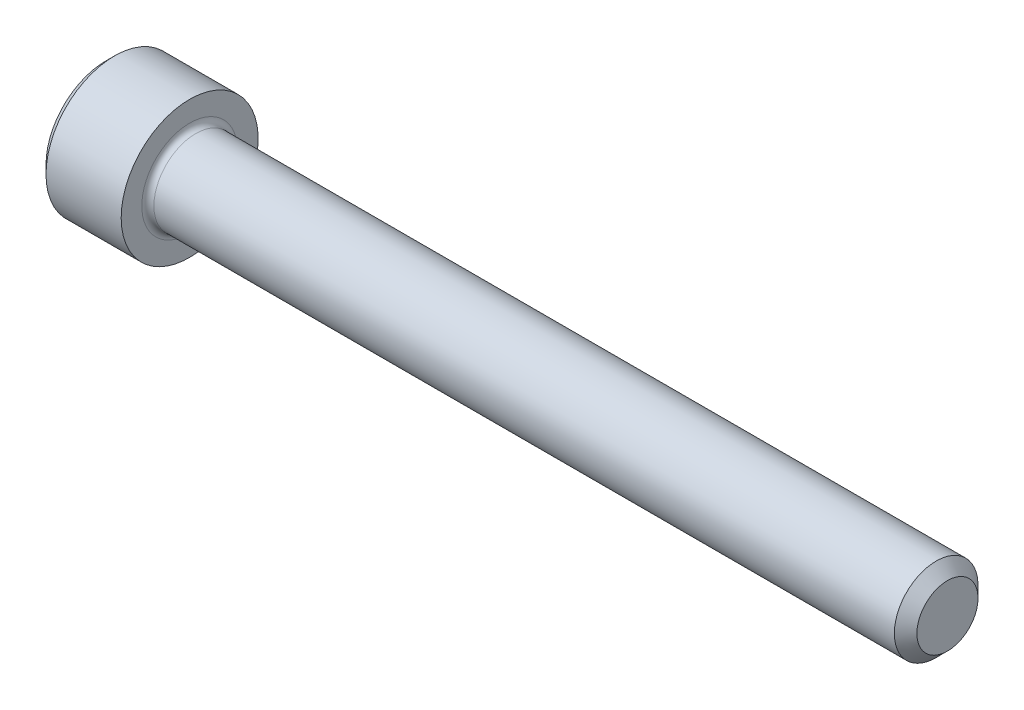
ISO-10303-21;
HEADER;
FILE_DESCRIPTION(('STEP AP214'),'2;1');
FILE_NAME('part.step','',(''),(''),'','','');
FILE_SCHEMA(('AUTOMOTIVE_DESIGN { 1 0 10303 214 1 1 1 1 }'));
ENDSEC;
DATA;
#1=APPLICATION_CONTEXT('core data for automotive mechanical design processes');
#2=APPLICATION_PROTOCOL_DEFINITION('international standard','automotive_design',2000,#1);
#3=PRODUCT_CONTEXT('',#1,'mechanical');
#4=PRODUCT('Part','Part','',(#3));
#5=PRODUCT_RELATED_PRODUCT_CATEGORY('part','',(#4));
#6=PRODUCT_DEFINITION_FORMATION('','',#4);
#7=PRODUCT_DEFINITION_CONTEXT('part definition',#1,'design');
#8=PRODUCT_DEFINITION('design','',#6,#7);
#9=PRODUCT_DEFINITION_SHAPE('','',#8);
#10=(LENGTH_UNIT() NAMED_UNIT(*) SI_UNIT(.MILLI.,.METRE.));
#11=(NAMED_UNIT(*) PLANE_ANGLE_UNIT() SI_UNIT($,.RADIAN.));
#12=(NAMED_UNIT(*) SI_UNIT($,.STERADIAN.) SOLID_ANGLE_UNIT());
#13=UNCERTAINTY_MEASURE_WITH_UNIT(LENGTH_MEASURE(1.E-05),#10,'distance_accuracy_value','');
#14=(GEOMETRIC_REPRESENTATION_CONTEXT(3) GLOBAL_UNCERTAINTY_ASSIGNED_CONTEXT((#13)) GLOBAL_UNIT_ASSIGNED_CONTEXT((#10,
#11,#12)) REPRESENTATION_CONTEXT('',''));
#15=CARTESIAN_POINT('',(0.,0.,0.));
#16=DIRECTION('',(0.,0.,1.));
#17=DIRECTION('',(1.,0.,0.));
#18=AXIS2_PLACEMENT_3D('',#15,#16,#17);
#19=CARTESIAN_POINT('',(0.,0.,0.));
#20=DIRECTION('',(-1.,0.,0.));
#21=DIRECTION('',(0.,0.,1.));
#22=AXIS2_PLACEMENT_3D('',#19,#20,#21);
#23=PLANE('',#22);
#24=DIRECTION('',(0.,-0.499999999999999,0.866025403784439));
#25=VECTOR('',#24,1.);
#26=CARTESIAN_POINT('',(0.,1.5984519552784,0.));
#27=LINE('',#26,#25);
#28=CARTESIAN_POINT('',(0.,1.5984519552784,0.));
#29=VERTEX_POINT('',#28);
#30=CARTESIAN_POINT('',(0.,0.799225977639205,1.3843));
#31=VERTEX_POINT('',#30);
#32=EDGE_CURVE('E390',#29,#31,#27,.T.);
#33=ORIENTED_EDGE('',*,*,#32,.T.);
#34=DIRECTION('',(0.,1.,0.));
#35=VECTOR('',#34,1.);
#36=CARTESIAN_POINT('',(0.,-0.799225977639191,1.3843));
#37=LINE('',#36,#35);
#38=CARTESIAN_POINT('',(0.,-0.799225977639191,1.3843));
#39=VERTEX_POINT('',#38);
#40=EDGE_CURVE('E132',#39,#31,#37,.T.);
#41=ORIENTED_EDGE('',*,*,#40,.F.);
#42=DIRECTION('',(0.,-0.500000000000001,-0.866025403784438));
#43=VECTOR('',#42,1.);
#44=CARTESIAN_POINT('',(0.,-0.799225977639191,1.3843));
#45=LINE('',#44,#43);
#46=CARTESIAN_POINT('',(0.,-1.59845195527839,0.));
#47=VERTEX_POINT('',#46);
#48=EDGE_CURVE('E393',#39,#47,#45,.T.);
#49=ORIENTED_EDGE('',*,*,#48,.T.);
#50=DIRECTION('',(0.,0.499999999999999,-0.86602540378444));
#51=VECTOR('',#50,1.);
#52=CARTESIAN_POINT('',(0.,-1.59845195527839,0.));
#53=LINE('',#52,#51);
#54=CARTESIAN_POINT('',(0.,-0.799225977639196,-1.3843));
#55=VERTEX_POINT('',#54);
#56=EDGE_CURVE('E396',#47,#55,#53,.T.);
#57=ORIENTED_EDGE('',*,*,#56,.T.);
#58=DIRECTION('',(0.,-1.,0.));
#59=VECTOR('',#58,1.);
#60=CARTESIAN_POINT('',(0.,0.799225977639202,-1.3843));
#61=LINE('',#60,#59);
#62=CARTESIAN_POINT('',(0.,0.799225977639202,-1.3843));
#63=VERTEX_POINT('',#62);
#64=EDGE_CURVE('E399',#63,#55,#61,.T.);
#65=ORIENTED_EDGE('',*,*,#64,.F.);
#66=DIRECTION('',(0.,-0.500000000000001,-0.866025403784438));
#67=VECTOR('',#66,1.);
#68=CARTESIAN_POINT('',(0.,1.5984519552784,0.));
#69=LINE('',#68,#67);
#70=EDGE_CURVE('E127',#29,#63,#69,.T.);
#71=ORIENTED_EDGE('',*,*,#70,.F.);
#72=EDGE_LOOP('',(#33,#41,#49,#57,#65,#71));
#73=FACE_BOUND('',#72,.T.);
#74=CARTESIAN_POINT('',(0.,0.,0.));
#75=DIRECTION('',(-1.,0.,0.));
#76=DIRECTION('',(0.,0.,1.));
#77=AXIS2_PLACEMENT_3D('',#74,#75,#76);
#78=CIRCLE('',#77,2.51460000000001);
#79=CARTESIAN_POINT('',(0.,0.,2.51460000000001));
#80=VERTEX_POINT('',#79);
#81=EDGE_CURVE('E143',#80,#80,#78,.T.);
#82=ORIENTED_EDGE('',*,*,#81,.T.);
#83=EDGE_LOOP('',(#82));
#84=FACE_BOUND('',#83,.T.);
#85=ADVANCED_FACE('F36',(#73,#84),#23,.T.);
#86=CARTESIAN_POINT('',(35.2552,1.28016,0.));
#87=DIRECTION('',(1.,0.,0.));
#88=DIRECTION('',(0.,0.,-1.));
#89=AXIS2_PLACEMENT_3D('',#86,#87,#88);
#90=PLANE('',#89);
#91=CARTESIAN_POINT('',(35.2552,0.,0.));
#92=DIRECTION('',(-1.,0.,0.));
#93=DIRECTION('',(0.,0.,1.));
#94=AXIS2_PLACEMENT_3D('',#91,#92,#93);
#95=CIRCLE('',#94,1.28016);
#96=CARTESIAN_POINT('',(35.2552,0.,1.28016));
#97=VERTEX_POINT('',#96);
#98=EDGE_CURVE('E156',#97,#97,#95,.T.);
#99=ORIENTED_EDGE('',*,*,#98,.F.);
#100=EDGE_LOOP('',(#99));
#101=FACE_BOUND('',#100,.T.);
#102=ADVANCED_FACE('F177',(#101),#90,.T.);
#103=CARTESIAN_POINT('',(35.2552,0.,0.));
#104=DIRECTION('',(-1.,0.,0.));
#105=DIRECTION('',(0.,0.,1.));
#106=AXIS2_PLACEMENT_3D('',#103,#104,#105);
#107=CONICAL_SURFACE('',#106,1.28016,0.785398163397457);
#108=CARTESIAN_POINT('',(34.78276,0.,0.));
#109=DIRECTION('',(-1.,0.,0.));
#110=DIRECTION('',(0.,0.,1.));
#111=AXIS2_PLACEMENT_3D('',#108,#109,#110);
#112=CIRCLE('',#111,1.7526);
#113=CARTESIAN_POINT('',(34.78276,0.,1.7526));
#114=VERTEX_POINT('',#113);
#115=EDGE_CURVE('E153',#114,#114,#112,.T.);
#116=ORIENTED_EDGE('',*,*,#115,.F.);
#117=EDGE_LOOP('',(#116));
#118=FACE_BOUND('',#117,.T.);
#119=ORIENTED_EDGE('',*,*,#98,.T.);
#120=EDGE_LOOP('',(#119));
#121=FACE_BOUND('',#120,.T.);
#122=ADVANCED_FACE('F183',(#118,#121),#107,.T.);
#123=CARTESIAN_POINT('',(-31.75,0.,0.));
#124=DIRECTION('',(-1.,0.,0.));
#125=DIRECTION('',(0.,0.,1.));
#126=AXIS2_PLACEMENT_3D('',#123,#124,#125);
#127=CYLINDRICAL_SURFACE('',#126,1.7526);
#128=CARTESIAN_POINT('',(3.7592,0.,0.));
#129=DIRECTION('',(1.,0.,0.));
#130=DIRECTION('',(0.,0.,-1.));
#131=AXIS2_PLACEMENT_3D('',#128,#129,#130);
#132=CIRCLE('',#131,1.7526);
#133=CARTESIAN_POINT('',(3.7592,0.,-1.7526));
#134=VERTEX_POINT('',#133);
#135=EDGE_CURVE('E11',#134,#134,#132,.T.);
#136=ORIENTED_EDGE('',*,*,#135,.T.);
#137=EDGE_LOOP('',(#136));
#138=FACE_BOUND('',#137,.T.);
#139=ORIENTED_EDGE('',*,*,#115,.T.);
#140=EDGE_LOOP('',(#139));
#141=FACE_BOUND('',#140,.T.);
#142=ADVANCED_FACE('F194',(#138,#141),#127,.T.);
#143=CARTESIAN_POINT('',(3.5052,2.8702,0.));
#144=DIRECTION('',(1.,0.,0.));
#145=DIRECTION('',(0.,0.,-1.));
#146=AXIS2_PLACEMENT_3D('',#143,#144,#145);
#147=PLANE('',#146);
#148=CARTESIAN_POINT('',(3.5052,0.,0.));
#149=DIRECTION('',(1.,0.,0.));
#150=DIRECTION('',(0.,0.,-1.));
#151=AXIS2_PLACEMENT_3D('',#148,#149,#150);
#152=CIRCLE('',#151,2.0066);
#153=CARTESIAN_POINT('',(3.5052,0.,-2.0066));
#154=VERTEX_POINT('',#153);
#155=EDGE_CURVE('E44',#154,#154,#152,.F.);
#156=ORIENTED_EDGE('',*,*,#155,.T.);
#157=EDGE_LOOP('',(#156));
#158=FACE_BOUND('',#157,.T.);
#159=CARTESIAN_POINT('',(3.5052,0.,0.));
#160=DIRECTION('',(-1.,0.,0.));
#161=DIRECTION('',(0.,0.,1.));
#162=AXIS2_PLACEMENT_3D('',#159,#160,#161);
#163=CIRCLE('',#162,2.8702);
#164=CARTESIAN_POINT('',(3.5052,0.,2.8702));
#165=VERTEX_POINT('',#164);
#166=EDGE_CURVE('E150',#165,#165,#163,.T.);
#167=ORIENTED_EDGE('',*,*,#166,.F.);
#168=EDGE_LOOP('',(#167));
#169=FACE_BOUND('',#168,.T.);
#170=ADVANCED_FACE('F161',(#158,#169),#147,.T.);
#171=CARTESIAN_POINT('',(-31.75,0.,0.));
#172=DIRECTION('',(-1.,0.,0.));
#173=DIRECTION('',(0.,0.,1.));
#174=AXIS2_PLACEMENT_3D('',#171,#172,#173);
#175=CYLINDRICAL_SURFACE('',#174,2.8702);
#176=ORIENTED_EDGE('',*,*,#166,.T.);
#177=EDGE_LOOP('',(#176));
#178=FACE_BOUND('',#177,.T.);
#179=CARTESIAN_POINT('',(0.355600000000005,0.,0.));
#180=DIRECTION('',(-1.,0.,0.));
#181=DIRECTION('',(0.,0.,1.));
#182=AXIS2_PLACEMENT_3D('',#179,#180,#181);
#183=CIRCLE('',#182,2.8702);
#184=CARTESIAN_POINT('',(0.355600000000005,0.,2.8702));
#185=VERTEX_POINT('',#184);
#186=EDGE_CURVE('E147',#185,#185,#183,.T.);
#187=ORIENTED_EDGE('',*,*,#186,.F.);
#188=EDGE_LOOP('',(#187));
#189=FACE_BOUND('',#188,.T.);
#190=ADVANCED_FACE('F172',(#178,#189),#175,.T.);
#191=CARTESIAN_POINT('',(0.,0.,0.));
#192=DIRECTION('',(1.,0.,0.));
#193=DIRECTION('',(0.,0.,-1.));
#194=AXIS2_PLACEMENT_3D('',#191,#192,#193);
#195=CONICAL_SURFACE('',#194,2.51460000000001,0.785398163397436);
#196=ORIENTED_EDGE('',*,*,#186,.T.);
#197=EDGE_LOOP('',(#196));
#198=FACE_BOUND('',#197,.T.);
#199=ORIENTED_EDGE('',*,*,#81,.F.);
#200=EDGE_LOOP('',(#199));
#201=FACE_BOUND('',#200,.T.);
#202=ADVANCED_FACE('F165',(#198,#201),#195,.T.);
#203=CARTESIAN_POINT('',(3.7592,0.,0.));
#204=DIRECTION('',(1.,0.,0.));
#205=DIRECTION('',(0.,0.,-1.));
#206=AXIS2_PLACEMENT_3D('',#203,#204,#205);
#207=TOROIDAL_SURFACE('',#206,2.0066,0.254);
#208=ORIENTED_EDGE('',*,*,#135,.F.);
#209=EDGE_LOOP('',(#208));
#210=FACE_BOUND('',#209,.T.);
#211=ORIENTED_EDGE('',*,*,#155,.F.);
#212=EDGE_LOOP('',(#211));
#213=FACE_BOUND('',#212,.T.);
#214=ADVANCED_FACE('F38',(#210,#213),#207,.F.);
#215=CARTESIAN_POINT('',(1.6256,1.5984519552784,0.));
#216=DIRECTION('',(0.,-0.866025403784439,-0.499999999999999));
#217=DIRECTION('',(0.,0.499999999999999,-0.866025403784439));
#218=AXIS2_PLACEMENT_3D('',#215,#216,#217);
#219=PLANE('',#218);
#220=ORIENTED_EDGE('',*,*,#32,.F.);
#221=DIRECTION('',(-1.,0.,0.));
#222=VECTOR('',#221,1.);
#223=CARTESIAN_POINT('',(1.6256,1.5984519552784,0.));
#224=LINE('',#223,#222);
#225=CARTESIAN_POINT('',(1.6256,1.5984519552784,0.));
#226=VERTEX_POINT('',#225);
#227=EDGE_CURVE('E380',#226,#29,#224,.T.);
#228=ORIENTED_EDGE('',*,*,#227,.F.);
#229=DIRECTION('',(0.,-0.499999999999999,0.866025403784439));
#230=VECTOR('',#229,1.);
#231=CARTESIAN_POINT('',(1.6256,1.5984519552784,0.));
#232=LINE('',#231,#230);
#233=CARTESIAN_POINT('',(1.6256,1.1988389664588,0.692150000000001));
#234=VERTEX_POINT('',#233);
#235=EDGE_CURVE('E119',#226,#234,#232,.T.);
#236=ORIENTED_EDGE('',*,*,#235,.T.);
#237=CARTESIAN_POINT('',(1.6256,0.799225977639205,1.3843));
#238=VERTEX_POINT('',#237);
#239=EDGE_CURVE('E110',#234,#238,#232,.T.);
#240=ORIENTED_EDGE('',*,*,#239,.T.);
#241=DIRECTION('',(-1.,0.,0.));
#242=VECTOR('',#241,1.);
#243=CARTESIAN_POINT('',(1.6256,0.799225977639205,1.3843));
#244=LINE('',#243,#242);
#245=EDGE_CURVE('E124',#238,#31,#244,.T.);
#246=ORIENTED_EDGE('',*,*,#245,.T.);
#247=EDGE_LOOP('',(#220,#228,#236,#240,#246));
#248=FACE_BOUND('',#247,.T.);
#249=ADVANCED_FACE('F123',(#248),#219,.T.);
#250=CARTESIAN_POINT('',(1.6256,-0.799225977639191,1.3843));
#251=DIRECTION('',(0.,0.,1.));
#252=DIRECTION('',(0.,-1.,0.));
#253=AXIS2_PLACEMENT_3D('',#250,#251,#252);
#254=PLANE('',#253);
#255=ORIENTED_EDGE('',*,*,#40,.T.);
#256=ORIENTED_EDGE('',*,*,#245,.F.);
#257=DIRECTION('',(0.,1.,0.));
#258=VECTOR('',#257,1.);
#259=CARTESIAN_POINT('',(1.6256,-0.799225977639191,1.3843));
#260=LINE('',#259,#258);
#261=CARTESIAN_POINT('',(1.6256,0.,1.3843));
#262=VERTEX_POINT('',#261);
#263=EDGE_CURVE('E107',#262,#238,#260,.T.);
#264=ORIENTED_EDGE('',*,*,#263,.F.);
#265=CARTESIAN_POINT('',(1.6256,-0.799225977639191,1.3843));
#266=VERTEX_POINT('',#265);
#267=EDGE_CURVE('E118',#266,#262,#260,.T.);
#268=ORIENTED_EDGE('',*,*,#267,.F.);
#269=DIRECTION('',(-1.,0.,0.));
#270=VECTOR('',#269,1.);
#271=CARTESIAN_POINT('',(1.6256,-0.799225977639191,1.3843));
#272=LINE('',#271,#270);
#273=EDGE_CURVE('E134',#266,#39,#272,.T.);
#274=ORIENTED_EDGE('',*,*,#273,.T.);
#275=EDGE_LOOP('',(#255,#256,#264,#268,#274));
#276=FACE_BOUND('',#275,.T.);
#277=ADVANCED_FACE('F129',(#276),#254,.F.);
#278=CARTESIAN_POINT('',(1.6256,-0.799225977639191,1.3843));
#279=DIRECTION('',(0.,0.866025403784438,-0.500000000000001));
#280=DIRECTION('',(0.,0.500000000000001,0.866025403784438));
#281=AXIS2_PLACEMENT_3D('',#278,#279,#280);
#282=PLANE('',#281);
#283=ORIENTED_EDGE('',*,*,#48,.F.);
#284=ORIENTED_EDGE('',*,*,#273,.F.);
#285=DIRECTION('',(0.,-0.500000000000001,-0.866025403784438));
#286=VECTOR('',#285,1.);
#287=CARTESIAN_POINT('',(1.6256,-0.799225977639191,1.3843));
#288=LINE('',#287,#286);
#289=CARTESIAN_POINT('',(1.6256,-1.19883896645879,0.692149999999999));
#290=VERTEX_POINT('',#289);
#291=EDGE_CURVE('E419',#266,#290,#288,.T.);
#292=ORIENTED_EDGE('',*,*,#291,.T.);
#293=CARTESIAN_POINT('',(1.6256,-1.59845195527839,0.));
#294=VERTEX_POINT('',#293);
#295=EDGE_CURVE('E408',#290,#294,#288,.T.);
#296=ORIENTED_EDGE('',*,*,#295,.T.);
#297=DIRECTION('',(-1.,0.,0.));
#298=VECTOR('',#297,1.);
#299=CARTESIAN_POINT('',(1.6256,-1.59845195527839,0.));
#300=LINE('',#299,#298);
#301=EDGE_CURVE('E139',#294,#47,#300,.T.);
#302=ORIENTED_EDGE('',*,*,#301,.T.);
#303=EDGE_LOOP('',(#283,#284,#292,#296,#302));
#304=FACE_BOUND('',#303,.T.);
#305=ADVANCED_FACE('F271',(#304),#282,.T.);
#306=CARTESIAN_POINT('',(1.6256,-1.59845195527839,0.));
#307=DIRECTION('',(0.,0.866025403784439,0.499999999999999));
#308=DIRECTION('',(0.,-0.499999999999999,0.866025403784439));
#309=AXIS2_PLACEMENT_3D('',#306,#307,#308);
#310=PLANE('',#309);
#311=ORIENTED_EDGE('',*,*,#56,.F.);
#312=ORIENTED_EDGE('',*,*,#301,.F.);
#313=DIRECTION('',(0.,0.499999999999999,-0.86602540378444));
#314=VECTOR('',#313,1.);
#315=CARTESIAN_POINT('',(1.6256,-1.59845195527839,0.));
#316=LINE('',#315,#314);
#317=CARTESIAN_POINT('',(1.6256,-1.1988389664588,-0.692149999999996));
#318=VERTEX_POINT('',#317);
#319=EDGE_CURVE('E386',#294,#318,#316,.T.);
#320=ORIENTED_EDGE('',*,*,#319,.T.);
#321=CARTESIAN_POINT('',(1.6256,-0.799225977639196,-1.3843));
#322=VERTEX_POINT('',#321);
#323=EDGE_CURVE('E418',#318,#322,#316,.T.);
#324=ORIENTED_EDGE('',*,*,#323,.T.);
#325=DIRECTION('',(-1.,0.,0.));
#326=VECTOR('',#325,1.);
#327=CARTESIAN_POINT('',(1.6256,-0.799225977639196,-1.3843));
#328=LINE('',#327,#326);
#329=EDGE_CURVE('E379',#322,#55,#328,.T.);
#330=ORIENTED_EDGE('',*,*,#329,.T.);
#331=EDGE_LOOP('',(#311,#312,#320,#324,#330));
#332=FACE_BOUND('',#331,.T.);
#333=ADVANCED_FACE('F279',(#332),#310,.T.);
#334=CARTESIAN_POINT('',(1.6256,0.799225977639202,-1.3843));
#335=DIRECTION('',(0.,0.,-1.));
#336=DIRECTION('',(0.,1.,0.));
#337=AXIS2_PLACEMENT_3D('',#334,#335,#336);
#338=PLANE('',#337);
#339=ORIENTED_EDGE('',*,*,#64,.T.);
#340=ORIENTED_EDGE('',*,*,#329,.F.);
#341=DIRECTION('',(0.,-1.,0.));
#342=VECTOR('',#341,1.);
#343=CARTESIAN_POINT('',(1.6256,0.799225977639202,-1.3843));
#344=LINE('',#343,#342);
#345=CARTESIAN_POINT('',(1.6256,0.,-1.3843));
#346=VERTEX_POINT('',#345);
#347=EDGE_CURVE('E383',#346,#322,#344,.T.);
#348=ORIENTED_EDGE('',*,*,#347,.F.);
#349=CARTESIAN_POINT('',(1.6256,0.799225977639202,-1.3843));
#350=VERTEX_POINT('',#349);
#351=EDGE_CURVE('E51',#350,#346,#344,.T.);
#352=ORIENTED_EDGE('',*,*,#351,.F.);
#353=DIRECTION('',(-1.,0.,0.));
#354=VECTOR('',#353,1.);
#355=CARTESIAN_POINT('',(1.6256,0.799225977639202,-1.3843));
#356=LINE('',#355,#354);
#357=EDGE_CURVE('E376',#350,#63,#356,.T.);
#358=ORIENTED_EDGE('',*,*,#357,.T.);
#359=EDGE_LOOP('',(#339,#340,#348,#352,#358));
#360=FACE_BOUND('',#359,.T.);
#361=ADVANCED_FACE('F288',(#360),#338,.F.);
#362=CARTESIAN_POINT('',(1.6256,1.5984519552784,0.));
#363=DIRECTION('',(0.,0.866025403784438,-0.500000000000001));
#364=DIRECTION('',(0.,0.500000000000001,0.866025403784438));
#365=AXIS2_PLACEMENT_3D('',#362,#363,#364);
#366=PLANE('',#365);
#367=ORIENTED_EDGE('',*,*,#70,.T.);
#368=ORIENTED_EDGE('',*,*,#357,.F.);
#369=DIRECTION('',(0.,-0.500000000000001,-0.866025403784438));
#370=VECTOR('',#369,1.);
#371=CARTESIAN_POINT('',(1.6256,1.5984519552784,0.));
#372=LINE('',#371,#370);
#373=CARTESIAN_POINT('',(1.6256,1.1988389664588,-0.692150000000004));
#374=VERTEX_POINT('',#373);
#375=EDGE_CURVE('E366',#374,#350,#372,.T.);
#376=ORIENTED_EDGE('',*,*,#375,.F.);
#377=EDGE_CURVE('E372',#226,#374,#372,.T.);
#378=ORIENTED_EDGE('',*,*,#377,.F.);
#379=ORIENTED_EDGE('',*,*,#227,.T.);
#380=EDGE_LOOP('',(#367,#368,#376,#378,#379));
#381=FACE_BOUND('',#380,.T.);
#382=ADVANCED_FACE('F297',(#381),#366,.F.);
#383=CARTESIAN_POINT('',(1.6256,0.,2.7686));
#384=DIRECTION('',(1.,0.,0.));
#385=DIRECTION('',(0.,0.,-1.));
#386=AXIS2_PLACEMENT_3D('',#383,#384,#385);
#387=PLANE('',#386);
#388=ORIENTED_EDGE('',*,*,#347,.T.);
#389=ORIENTED_EDGE('',*,*,#323,.F.);
#390=CARTESIAN_POINT('',(1.6256,0.,0.));
#391=DIRECTION('',(-1.,0.,0.));
#392=DIRECTION('',(0.,0.,1.));
#393=AXIS2_PLACEMENT_3D('',#390,#391,#392);
#394=CIRCLE('',#393,1.3843);
#395=EDGE_CURVE('E414',#346,#318,#394,.T.);
#396=ORIENTED_EDGE('',*,*,#395,.F.);
#397=EDGE_LOOP('',(#388,#389,#396));
#398=FACE_BOUND('',#397,.T.);
#399=ADVANCED_FACE('F306',(#398),#387,.F.);
#400=ORIENTED_EDGE('',*,*,#319,.F.);
#401=ORIENTED_EDGE('',*,*,#295,.F.);
#402=EDGE_CURVE('E137',#318,#290,#394,.T.);
#403=ORIENTED_EDGE('',*,*,#402,.F.);
#404=EDGE_LOOP('',(#400,#401,#403));
#405=FACE_BOUND('',#404,.T.);
#406=ADVANCED_FACE('F315',(#405),#387,.F.);
#407=ORIENTED_EDGE('',*,*,#291,.F.);
#408=ORIENTED_EDGE('',*,*,#267,.T.);
#409=EDGE_CURVE('E133',#290,#262,#394,.T.);
#410=ORIENTED_EDGE('',*,*,#409,.F.);
#411=EDGE_LOOP('',(#407,#408,#410));
#412=FACE_BOUND('',#411,.T.);
#413=ADVANCED_FACE('F324',(#412),#387,.F.);
#414=ORIENTED_EDGE('',*,*,#263,.T.);
#415=ORIENTED_EDGE('',*,*,#239,.F.);
#416=EDGE_CURVE('E113',#262,#234,#394,.T.);
#417=ORIENTED_EDGE('',*,*,#416,.F.);
#418=EDGE_LOOP('',(#414,#415,#417));
#419=FACE_BOUND('',#418,.T.);
#420=ADVANCED_FACE('F109',(#419),#387,.F.);
#421=ORIENTED_EDGE('',*,*,#235,.F.);
#422=ORIENTED_EDGE('',*,*,#377,.T.);
#423=EDGE_CURVE('E144',#234,#374,#394,.T.);
#424=ORIENTED_EDGE('',*,*,#423,.F.);
#425=EDGE_LOOP('',(#421,#422,#424));
#426=FACE_BOUND('',#425,.T.);
#427=ADVANCED_FACE('F339',(#426),#387,.F.);
#428=ORIENTED_EDGE('',*,*,#375,.T.);
#429=ORIENTED_EDGE('',*,*,#351,.T.);
#430=EDGE_CURVE('E369',#374,#346,#394,.T.);
#431=ORIENTED_EDGE('',*,*,#430,.F.);
#432=EDGE_LOOP('',(#428,#429,#431));
#433=FACE_BOUND('',#432,.T.);
#434=ADVANCED_FACE('F254',(#433),#387,.F.);
#435=CARTESIAN_POINT('',(1.6256,0.,0.));
#436=DIRECTION('',(-1.,0.,0.));
#437=DIRECTION('',(0.,0.,1.));
#438=AXIS2_PLACEMENT_3D('',#435,#436,#437);
#439=CONICAL_SURFACE('',#438,1.3843,1.04719755119659);
#440=CARTESIAN_POINT('',(2.4248259776392,0.,0.));
#441=VERTEX_POINT('',#440);
#442=VERTEX_LOOP('',#441);
#443=FACE_BOUND('',#442,.T.);
#444=ORIENTED_EDGE('',*,*,#416,.T.);
#445=ORIENTED_EDGE('',*,*,#423,.T.);
#446=ORIENTED_EDGE('',*,*,#430,.T.);
#447=ORIENTED_EDGE('',*,*,#395,.T.);
#448=ORIENTED_EDGE('',*,*,#402,.T.);
#449=ORIENTED_EDGE('',*,*,#409,.T.);
#450=EDGE_LOOP('',(#444,#445,#446,#447,#448,#449));
#451=FACE_BOUND('',#450,.T.);
#452=ADVANCED_FACE('F187',(#443,#451),#439,.F.);
#453=CLOSED_SHELL('',(#85,#102,#122,#142,#170,#190,#202,#214,#249,#277,#305,#333,#361,#382,#399,
#406,#413,#420,#427,#434,#452));
#454=MANIFOLD_SOLID_BREP('B2',#453);
#455=ADVANCED_BREP_SHAPE_REPRESENTATION('',(#18,#454),#14);
#456=SHAPE_DEFINITION_REPRESENTATION(#9,#455);
ENDSEC;
END-ISO-10303-21;
